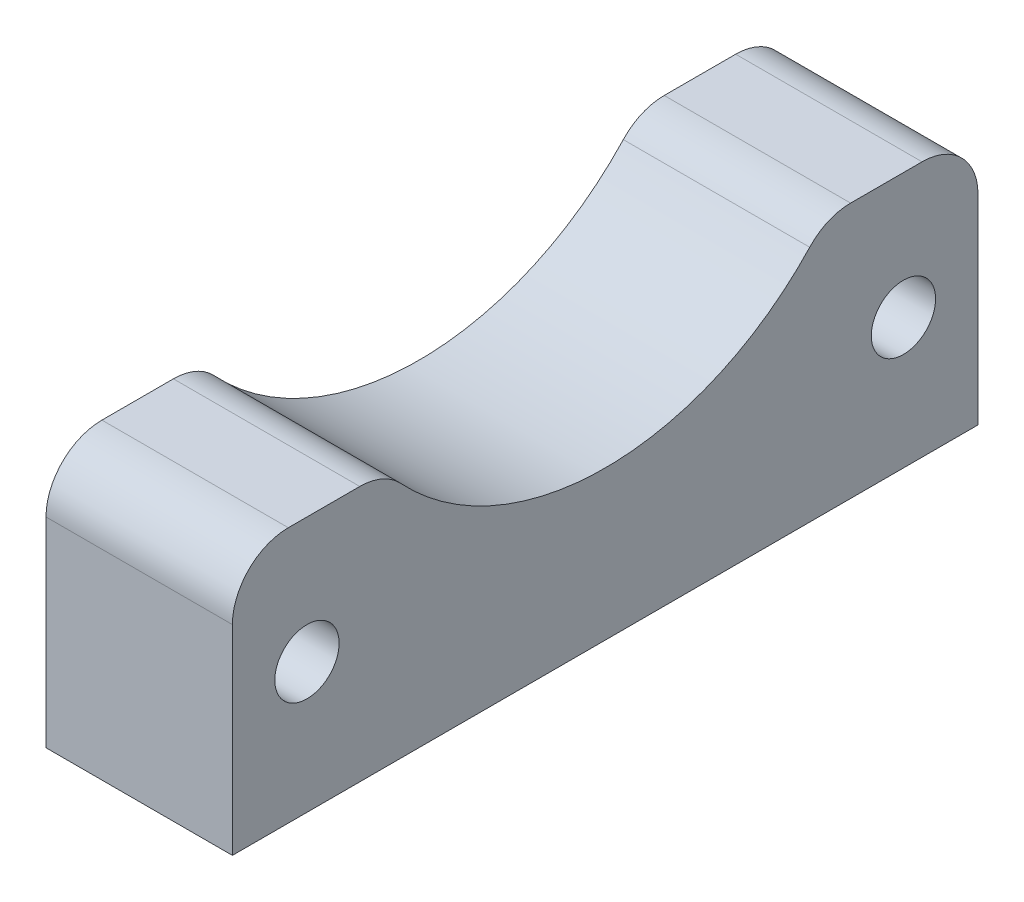
ISO-10303-21;
HEADER;
FILE_DESCRIPTION(('STEP AP214'),'2;1');
FILE_NAME('part.step','',(''),(''),'','','');
FILE_SCHEMA(('AUTOMOTIVE_DESIGN { 1 0 10303 214 1 1 1 1 }'));
ENDSEC;
DATA;
#1=APPLICATION_CONTEXT('core data for automotive mechanical design processes');
#2=APPLICATION_PROTOCOL_DEFINITION('international standard','automotive_design',2000,#1);
#3=PRODUCT_CONTEXT('',#1,'mechanical');
#4=PRODUCT('Part','Part','',(#3));
#5=PRODUCT_RELATED_PRODUCT_CATEGORY('part','',(#4));
#6=PRODUCT_DEFINITION_FORMATION('','',#4);
#7=PRODUCT_DEFINITION_CONTEXT('part definition',#1,'design');
#8=PRODUCT_DEFINITION('design','',#6,#7);
#9=PRODUCT_DEFINITION_SHAPE('','',#8);
#10=(LENGTH_UNIT() NAMED_UNIT(*) SI_UNIT(.MILLI.,.METRE.));
#11=(NAMED_UNIT(*) PLANE_ANGLE_UNIT() SI_UNIT($,.RADIAN.));
#12=(NAMED_UNIT(*) SI_UNIT($,.STERADIAN.) SOLID_ANGLE_UNIT());
#13=UNCERTAINTY_MEASURE_WITH_UNIT(LENGTH_MEASURE(1.E-05),#10,'distance_accuracy_value','');
#14=(GEOMETRIC_REPRESENTATION_CONTEXT(3) GLOBAL_UNCERTAINTY_ASSIGNED_CONTEXT((#13)) GLOBAL_UNIT_ASSIGNED_CONTEXT((#10,
#11,#12)) REPRESENTATION_CONTEXT('',''));
#15=CARTESIAN_POINT('',(0.,0.,0.));
#16=DIRECTION('',(0.,0.,1.));
#17=DIRECTION('',(1.,0.,0.));
#18=AXIS2_PLACEMENT_3D('',#15,#16,#17);
#19=CARTESIAN_POINT('',(109.527299651961,8.72499999999909,33.));
#20=DIRECTION('',(-1.,0.,0.));
#21=DIRECTION('',(0.,0.,1.));
#22=AXIS2_PLACEMENT_3D('',#19,#20,#21);
#23=CYLINDRICAL_SURFACE('',#22,3.);
#24=CARTESIAN_POINT('',(79.5272996519613,8.72499999999909,33.));
#25=DIRECTION('',(-1.,0.,0.));
#26=DIRECTION('',(0.,0.,1.));
#27=AXIS2_PLACEMENT_3D('',#24,#25,#26);
#28=CIRCLE('',#27,3.);
#29=CARTESIAN_POINT('',(79.5272996519613,11.7249999999991,33.));
#30=VERTEX_POINT('',#29);
#31=CARTESIAN_POINT('',(79.5272996519613,8.72499999999909,36.));
#32=VERTEX_POINT('',#31);
#33=EDGE_CURVE('E229',#30,#32,#28,.F.);
#34=ORIENTED_EDGE('',*,*,#33,.F.);
#35=DIRECTION('',(-1.,0.,0.));
#36=VECTOR('',#35,1.);
#37=CARTESIAN_POINT('',(109.527299651961,11.7249999999991,33.));
#38=LINE('',#37,#36);
#39=CARTESIAN_POINT('',(69.5272996519613,11.7249999999991,33.));
#40=VERTEX_POINT('',#39);
#41=EDGE_CURVE('E262',#30,#40,#38,.T.);
#42=ORIENTED_EDGE('',*,*,#41,.T.);
#43=CARTESIAN_POINT('',(69.5272996519613,8.72499999999909,33.));
#44=DIRECTION('',(-1.,0.,0.));
#45=DIRECTION('',(0.,0.,1.));
#46=AXIS2_PLACEMENT_3D('',#43,#44,#45);
#47=CIRCLE('',#46,3.);
#48=CARTESIAN_POINT('',(69.5272996519613,8.72499999999907,36.));
#49=VERTEX_POINT('',#48);
#50=EDGE_CURVE('E255',#49,#40,#47,.T.);
#51=ORIENTED_EDGE('',*,*,#50,.F.);
#52=DIRECTION('',(-1.,0.,0.));
#53=VECTOR('',#52,1.);
#54=CARTESIAN_POINT('',(109.527299651961,8.72499999999907,36.));
#55=LINE('',#54,#53);
#56=EDGE_CURVE('E260',#32,#49,#55,.T.);
#57=ORIENTED_EDGE('',*,*,#56,.F.);
#58=EDGE_LOOP('',(#34,#42,#51,#57));
#59=FACE_BOUND('',#58,.T.);
#60=ADVANCED_FACE('F109',(#59),#23,.T.);
#61=CARTESIAN_POINT('',(109.527299651961,11.7249999999991,0.));
#62=DIRECTION('',(0.,-1.,0.));
#63=DIRECTION('',(0.,0.,-1.));
#64=AXIS2_PLACEMENT_3D('',#61,#62,#63);
#65=PLANE('',#64);
#66=ORIENTED_EDGE('',*,*,#41,.F.);
#67=DIRECTION('',(0.,0.,-1.));
#68=VECTOR('',#67,1.);
#69=CARTESIAN_POINT('',(79.5272996519613,11.7249999999991,0.));
#70=LINE('',#69,#68);
#71=CARTESIAN_POINT('',(79.5272996519613,11.7249999999991,29.1652715505598));
#72=VERTEX_POINT('',#71);
#73=EDGE_CURVE('E226',#30,#72,#70,.T.);
#74=ORIENTED_EDGE('',*,*,#73,.T.);
#75=DIRECTION('',(-1.,0.,0.));
#76=VECTOR('',#75,1.);
#77=CARTESIAN_POINT('',(109.527299651961,11.7249999999991,29.1652715505598));
#78=LINE('',#77,#76);
#79=CARTESIAN_POINT('',(69.5272996519613,11.7249999999991,29.1652715505598));
#80=VERTEX_POINT('',#79);
#81=EDGE_CURVE('E264',#72,#80,#78,.T.);
#82=ORIENTED_EDGE('',*,*,#81,.T.);
#83=DIRECTION('',(0.,0.,1.));
#84=VECTOR('',#83,1.);
#85=CARTESIAN_POINT('',(69.5272996519613,11.7249999999991,0.));
#86=LINE('',#85,#84);
#87=EDGE_CURVE('E252',#80,#40,#86,.T.);
#88=ORIENTED_EDGE('',*,*,#87,.T.);
#89=EDGE_LOOP('',(#66,#74,#82,#88));
#90=FACE_BOUND('',#89,.T.);
#91=ADVANCED_FACE('F297',(#90),#65,.F.);
#92=CARTESIAN_POINT('',(109.527299651961,8.72499999999909,29.1652715505598));
#93=DIRECTION('',(-1.,0.,0.));
#94=DIRECTION('',(0.,0.,1.));
#95=AXIS2_PLACEMENT_3D('',#92,#93,#94);
#96=CYLINDRICAL_SURFACE('',#95,3.);
#97=CARTESIAN_POINT('',(79.5272996519613,8.72499999999909,29.1652715505598));
#98=DIRECTION('',(-1.,0.,0.));
#99=DIRECTION('',(0.,0.,1.));
#100=AXIS2_PLACEMENT_3D('',#97,#98,#99);
#101=CIRCLE('',#100,3.);
#102=CARTESIAN_POINT('',(79.5272996519613,10.7708333333326,26.9710596254665));
#103=VERTEX_POINT('',#102);
#104=EDGE_CURVE('E224',#103,#72,#101,.F.);
#105=ORIENTED_EDGE('',*,*,#104,.F.);
#106=DIRECTION('',(-1.,0.,0.));
#107=VECTOR('',#106,1.);
#108=CARTESIAN_POINT('',(109.527299651961,10.7708333333326,26.9710596254665));
#109=LINE('',#108,#107);
#110=CARTESIAN_POINT('',(69.5272996519613,10.7708333333326,26.9710596254665));
#111=VERTEX_POINT('',#110);
#112=EDGE_CURVE('E266',#103,#111,#109,.T.);
#113=ORIENTED_EDGE('',*,*,#112,.T.);
#114=CARTESIAN_POINT('',(69.5272996519613,8.72499999999909,29.1652715505598));
#115=DIRECTION('',(-1.,0.,0.));
#116=DIRECTION('',(0.,0.,1.));
#117=AXIS2_PLACEMENT_3D('',#114,#115,#116);
#118=CIRCLE('',#117,3.);
#119=EDGE_CURVE('E249',#80,#111,#118,.T.);
#120=ORIENTED_EDGE('',*,*,#119,.F.);
#121=ORIENTED_EDGE('',*,*,#81,.F.);
#122=EDGE_LOOP('',(#105,#113,#120,#121));
#123=FACE_BOUND('',#122,.T.);
#124=ADVANCED_FACE('F291',(#123),#96,.T.);
#125=CARTESIAN_POINT('',(109.527299651961,21.,16.));
#126=DIRECTION('',(-1.,0.,0.));
#127=DIRECTION('',(0.,0.,1.));
#128=AXIS2_PLACEMENT_3D('',#125,#126,#127);
#129=CYLINDRICAL_SURFACE('',#128,15.);
#130=ORIENTED_EDGE('',*,*,#112,.F.);
#131=CARTESIAN_POINT('',(79.5272996519613,21.,16.));
#132=DIRECTION('',(-1.,0.,0.));
#133=DIRECTION('',(0.,0.,1.));
#134=AXIS2_PLACEMENT_3D('',#131,#132,#133);
#135=CIRCLE('',#134,15.);
#136=CARTESIAN_POINT('',(79.5272996519613,10.7708333333326,5.02894037453354));
#137=VERTEX_POINT('',#136);
#138=EDGE_CURVE('E221',#103,#137,#135,.F.);
#139=ORIENTED_EDGE('',*,*,#138,.T.);
#140=DIRECTION('',(-1.,0.,0.));
#141=VECTOR('',#140,1.);
#142=CARTESIAN_POINT('',(109.527299651961,10.7708333333326,5.02894037453354));
#143=LINE('',#142,#141);
#144=CARTESIAN_POINT('',(69.5272996519613,10.7708333333326,5.02894037453354));
#145=VERTEX_POINT('',#144);
#146=EDGE_CURVE('E268',#137,#145,#143,.T.);
#147=ORIENTED_EDGE('',*,*,#146,.T.);
#148=CARTESIAN_POINT('',(69.5272996519613,21.,16.));
#149=DIRECTION('',(-1.,0.,0.));
#150=DIRECTION('',(0.,0.,1.));
#151=AXIS2_PLACEMENT_3D('',#148,#149,#150);
#152=CIRCLE('',#151,15.);
#153=EDGE_CURVE('E246',#145,#111,#152,.T.);
#154=ORIENTED_EDGE('',*,*,#153,.T.);
#155=EDGE_LOOP('',(#130,#139,#147,#154));
#156=FACE_BOUND('',#155,.T.);
#157=ADVANCED_FACE('F288',(#156),#129,.F.);
#158=CARTESIAN_POINT('',(109.527299651961,8.72499999999909,2.83472844944026));
#159=DIRECTION('',(-1.,0.,0.));
#160=DIRECTION('',(0.,0.,1.));
#161=AXIS2_PLACEMENT_3D('',#158,#159,#160);
#162=CYLINDRICAL_SURFACE('',#161,3.);
#163=ORIENTED_EDGE('',*,*,#146,.F.);
#164=CARTESIAN_POINT('',(79.5272996519613,8.72499999999909,2.83472844944026));
#165=DIRECTION('',(-1.,0.,0.));
#166=DIRECTION('',(0.,0.,1.));
#167=AXIS2_PLACEMENT_3D('',#164,#165,#166);
#168=CIRCLE('',#167,3.);
#169=CARTESIAN_POINT('',(79.5272996519613,11.7249999999991,2.83472844944026));
#170=VERTEX_POINT('',#169);
#171=EDGE_CURVE('E218',#137,#170,#168,.T.);
#172=ORIENTED_EDGE('',*,*,#171,.T.);
#173=DIRECTION('',(-1.,0.,0.));
#174=VECTOR('',#173,1.);
#175=CARTESIAN_POINT('',(109.527299651961,11.7249999999991,2.83472844944026));
#176=LINE('',#175,#174);
#177=CARTESIAN_POINT('',(69.5272996519613,11.7249999999991,2.83472844944026));
#178=VERTEX_POINT('',#177);
#179=EDGE_CURVE('E270',#170,#178,#176,.T.);
#180=ORIENTED_EDGE('',*,*,#179,.T.);
#181=CARTESIAN_POINT('',(69.5272996519613,8.72499999999909,2.83472844944026));
#182=DIRECTION('',(-1.,0.,0.));
#183=DIRECTION('',(0.,0.,1.));
#184=AXIS2_PLACEMENT_3D('',#181,#182,#183);
#185=CIRCLE('',#184,3.);
#186=EDGE_CURVE('E243',#178,#145,#185,.F.);
#187=ORIENTED_EDGE('',*,*,#186,.T.);
#188=EDGE_LOOP('',(#163,#172,#180,#187));
#189=FACE_BOUND('',#188,.T.);
#190=ADVANCED_FACE('F283',(#189),#162,.T.);
#191=CARTESIAN_POINT('',(109.527299651961,11.7249999999991,0.));
#192=DIRECTION('',(0.,1.,0.));
#193=DIRECTION('',(0.,0.,1.));
#194=AXIS2_PLACEMENT_3D('',#191,#192,#193);
#195=PLANE('',#194);
#196=DIRECTION('',(0.,0.,1.));
#197=VECTOR('',#196,1.);
#198=CARTESIAN_POINT('',(79.5272996519613,11.7249999999991,0.));
#199=LINE('',#198,#197);
#200=CARTESIAN_POINT('',(79.5272996519613,11.7249999999991,-0.999999999999979));
#201=VERTEX_POINT('',#200);
#202=EDGE_CURVE('E216',#201,#170,#199,.T.);
#203=ORIENTED_EDGE('',*,*,#202,.F.);
#204=DIRECTION('',(-1.,0.,0.));
#205=VECTOR('',#204,1.);
#206=CARTESIAN_POINT('',(109.527299651961,11.7249999999991,-0.999999999999979));
#207=LINE('',#206,#205);
#208=CARTESIAN_POINT('',(69.5272996519613,11.7249999999991,-0.999999999999979));
#209=VERTEX_POINT('',#208);
#210=EDGE_CURVE('E258',#201,#209,#207,.T.);
#211=ORIENTED_EDGE('',*,*,#210,.T.);
#212=DIRECTION('',(0.,0.,-1.));
#213=VECTOR('',#212,1.);
#214=CARTESIAN_POINT('',(69.5272996519613,11.7249999999991,0.));
#215=LINE('',#214,#213);
#216=EDGE_CURVE('E241',#178,#209,#215,.T.);
#217=ORIENTED_EDGE('',*,*,#216,.F.);
#218=ORIENTED_EDGE('',*,*,#179,.F.);
#219=EDGE_LOOP('',(#203,#211,#217,#218));
#220=FACE_BOUND('',#219,.T.);
#221=ADVANCED_FACE('F276',(#220),#195,.T.);
#222=CARTESIAN_POINT('',(109.527299651961,8.72499999999909,-0.999999999999999));
#223=DIRECTION('',(-1.,0.,0.));
#224=DIRECTION('',(0.,0.,1.));
#225=AXIS2_PLACEMENT_3D('',#222,#223,#224);
#226=CYLINDRICAL_SURFACE('',#225,3.);
#227=CARTESIAN_POINT('',(79.5272996519613,8.72499999999909,-0.999999999999999));
#228=DIRECTION('',(-1.,0.,0.));
#229=DIRECTION('',(0.,0.,1.));
#230=AXIS2_PLACEMENT_3D('',#227,#228,#229);
#231=CIRCLE('',#230,3.);
#232=CARTESIAN_POINT('',(79.5272996519613,8.72499999999907,-4.));
#233=VERTEX_POINT('',#232);
#234=EDGE_CURVE('E214',#233,#201,#231,.F.);
#235=ORIENTED_EDGE('',*,*,#234,.F.);
#236=DIRECTION('',(-1.,0.,0.));
#237=VECTOR('',#236,1.);
#238=CARTESIAN_POINT('',(109.527299651961,8.72499999999907,-4.));
#239=LINE('',#238,#237);
#240=CARTESIAN_POINT('',(69.5272996519613,8.72499999999907,-4.));
#241=VERTEX_POINT('',#240);
#242=EDGE_CURVE('E132',#233,#241,#239,.T.);
#243=ORIENTED_EDGE('',*,*,#242,.T.);
#244=CARTESIAN_POINT('',(69.5272996519613,8.72499999999909,-0.999999999999999));
#245=DIRECTION('',(-1.,0.,0.));
#246=DIRECTION('',(0.,0.,1.));
#247=AXIS2_PLACEMENT_3D('',#244,#245,#246);
#248=CIRCLE('',#247,3.);
#249=EDGE_CURVE('E192',#209,#241,#248,.T.);
#250=ORIENTED_EDGE('',*,*,#249,.F.);
#251=ORIENTED_EDGE('',*,*,#210,.F.);
#252=EDGE_LOOP('',(#235,#243,#250,#251));
#253=FACE_BOUND('',#252,.T.);
#254=ADVANCED_FACE('F279',(#253),#226,.T.);
#255=CARTESIAN_POINT('',(109.527299651961,4.99999999999909,7.91033905045424E-13));
#256=DIRECTION('',(-1.,0.,0.));
#257=DIRECTION('',(0.,0.,1.));
#258=AXIS2_PLACEMENT_3D('',#255,#256,#257);
#259=CYLINDRICAL_SURFACE('',#258,1.725);
#260=CARTESIAN_POINT('',(79.5272996519613,4.99999999999909,7.91033905045424E-13));
#261=DIRECTION('',(-1.,0.,0.));
#262=DIRECTION('',(0.,0.,1.));
#263=AXIS2_PLACEMENT_3D('',#260,#261,#262);
#264=CIRCLE('',#263,1.725);
#265=CARTESIAN_POINT('',(79.5272996519613,4.99999999999909,1.72500000000079));
#266=VERTEX_POINT('',#265);
#267=EDGE_CURVE('E211',#266,#266,#264,.F.);
#268=ORIENTED_EDGE('',*,*,#267,.T.);
#269=EDGE_LOOP('',(#268));
#270=FACE_BOUND('',#269,.T.);
#271=CARTESIAN_POINT('',(69.5272996519613,4.99999999999909,7.91033905045424E-13));
#272=DIRECTION('',(-1.,0.,0.));
#273=DIRECTION('',(0.,0.,1.));
#274=AXIS2_PLACEMENT_3D('',#271,#272,#273);
#275=CIRCLE('',#274,1.725);
#276=CARTESIAN_POINT('',(69.5272996519613,4.99999999999909,1.72500000000079));
#277=VERTEX_POINT('',#276);
#278=EDGE_CURVE('E235',#277,#277,#275,.T.);
#279=ORIENTED_EDGE('',*,*,#278,.T.);
#280=EDGE_LOOP('',(#279));
#281=FACE_BOUND('',#280,.T.);
#282=ADVANCED_FACE('F330',(#270,#281),#259,.F.);
#283=CARTESIAN_POINT('',(109.527299651961,4.99999999999876,32.0000000000008));
#284=DIRECTION('',(-1.,0.,0.));
#285=DIRECTION('',(0.,0.,1.));
#286=AXIS2_PLACEMENT_3D('',#283,#284,#285);
#287=CYLINDRICAL_SURFACE('',#286,1.725);
#288=CARTESIAN_POINT('',(79.5272996519613,4.99999999999876,32.0000000000008));
#289=DIRECTION('',(-1.,0.,0.));
#290=DIRECTION('',(0.,0.,1.));
#291=AXIS2_PLACEMENT_3D('',#288,#289,#290);
#292=CIRCLE('',#291,1.725);
#293=CARTESIAN_POINT('',(79.5272996519613,4.99999999999876,33.7250000000008));
#294=VERTEX_POINT('',#293);
#295=EDGE_CURVE('E113',#294,#294,#292,.F.);
#296=ORIENTED_EDGE('',*,*,#295,.T.);
#297=EDGE_LOOP('',(#296));
#298=FACE_BOUND('',#297,.T.);
#299=CARTESIAN_POINT('',(69.5272996519613,4.99999999999876,32.0000000000008));
#300=DIRECTION('',(-1.,0.,0.));
#301=DIRECTION('',(0.,0.,1.));
#302=AXIS2_PLACEMENT_3D('',#299,#300,#301);
#303=CIRCLE('',#302,1.725);
#304=CARTESIAN_POINT('',(69.5272996519613,4.99999999999876,33.7250000000008));
#305=VERTEX_POINT('',#304);
#306=EDGE_CURVE('E234',#305,#305,#303,.T.);
#307=ORIENTED_EDGE('',*,*,#306,.T.);
#308=EDGE_LOOP('',(#307));
#309=FACE_BOUND('',#308,.T.);
#310=ADVANCED_FACE('F309',(#298,#309),#287,.F.);
#311=CARTESIAN_POINT('',(79.5272996519613,13.5848612168019,38.8));
#312=DIRECTION('',(-1.,0.,0.));
#313=DIRECTION('',(0.,0.,1.));
#314=AXIS2_PLACEMENT_3D('',#311,#312,#313);
#315=PLANE('',#314);
#316=ORIENTED_EDGE('',*,*,#295,.F.);
#317=EDGE_LOOP('',(#316));
#318=FACE_BOUND('',#317,.T.);
#319=ORIENTED_EDGE('',*,*,#267,.F.);
#320=EDGE_LOOP('',(#319));
#321=FACE_BOUND('',#320,.T.);
#322=DIRECTION('',(0.,1.,0.));
#323=VECTOR('',#322,1.);
#324=CARTESIAN_POINT('',(79.5272996519613,41.,36.));
#325=LINE('',#324,#323);
#326=CARTESIAN_POINT('',(79.5272996519613,-2.,36.));
#327=VERTEX_POINT('',#326);
#328=EDGE_CURVE('E231',#327,#32,#325,.T.);
#329=ORIENTED_EDGE('',*,*,#328,.F.);
#330=DIRECTION('',(0.,0.,1.));
#331=VECTOR('',#330,1.);
#332=CARTESIAN_POINT('',(79.5272996519613,-2.,36.));
#333=LINE('',#332,#331);
#334=CARTESIAN_POINT('',(79.5272996519613,-2.,-4.));
#335=VERTEX_POINT('',#334);
#336=EDGE_CURVE('E200',#335,#327,#333,.T.);
#337=ORIENTED_EDGE('',*,*,#336,.F.);
#338=DIRECTION('',(0.,1.,0.));
#339=VECTOR('',#338,1.);
#340=CARTESIAN_POINT('',(79.5272996519613,13.5848612168019,-4.));
#341=LINE('',#340,#339);
#342=EDGE_CURVE('E125',#335,#233,#341,.T.);
#343=ORIENTED_EDGE('',*,*,#342,.T.);
#344=ORIENTED_EDGE('',*,*,#234,.T.);
#345=ORIENTED_EDGE('',*,*,#202,.T.);
#346=ORIENTED_EDGE('',*,*,#171,.F.);
#347=ORIENTED_EDGE('',*,*,#138,.F.);
#348=ORIENTED_EDGE('',*,*,#104,.T.);
#349=ORIENTED_EDGE('',*,*,#73,.F.);
#350=ORIENTED_EDGE('',*,*,#33,.T.);
#351=EDGE_LOOP('',(#329,#337,#343,#344,#345,#346,#347,#348,#349,#350));
#352=FACE_BOUND('',#351,.T.);
#353=ADVANCED_FACE('F284',(#318,#321,#352),#315,.F.);
#354=CARTESIAN_POINT('',(69.5272996519613,41.,36.));
#355=DIRECTION('',(0.,0.,-1.));
#356=DIRECTION('',(-1.,0.,0.));
#357=AXIS2_PLACEMENT_3D('',#354,#355,#356);
#358=PLANE('',#357);
#359=DIRECTION('',(0.,-1.,0.));
#360=VECTOR('',#359,1.);
#361=CARTESIAN_POINT('',(69.5272996519613,41.,36.));
#362=LINE('',#361,#360);
#363=CARTESIAN_POINT('',(69.5272996519613,-2.,36.));
#364=VERTEX_POINT('',#363);
#365=EDGE_CURVE('E12',#49,#364,#362,.T.);
#366=ORIENTED_EDGE('',*,*,#365,.T.);
#367=DIRECTION('',(-1.,0.,0.));
#368=VECTOR('',#367,1.);
#369=CARTESIAN_POINT('',(69.5272996519613,-2.,36.));
#370=LINE('',#369,#368);
#371=EDGE_CURVE('E205',#327,#364,#370,.T.);
#372=ORIENTED_EDGE('',*,*,#371,.F.);
#373=ORIENTED_EDGE('',*,*,#328,.T.);
#374=ORIENTED_EDGE('',*,*,#56,.T.);
#375=EDGE_LOOP('',(#366,#372,#373,#374));
#376=FACE_BOUND('',#375,.T.);
#377=ADVANCED_FACE('F302',(#376),#358,.F.);
#378=CARTESIAN_POINT('',(69.5272996519613,41.,-4.));
#379=DIRECTION('',(0.,0.,1.));
#380=DIRECTION('',(1.,0.,0.));
#381=AXIS2_PLACEMENT_3D('',#378,#379,#380);
#382=PLANE('',#381);
#383=ORIENTED_EDGE('',*,*,#242,.F.);
#384=ORIENTED_EDGE('',*,*,#342,.F.);
#385=DIRECTION('',(1.,0.,0.));
#386=VECTOR('',#385,1.);
#387=CARTESIAN_POINT('',(69.5272996519613,-2.,-4.));
#388=LINE('',#387,#386);
#389=CARTESIAN_POINT('',(69.5272996519613,-2.,-4.));
#390=VERTEX_POINT('',#389);
#391=EDGE_CURVE('E196',#390,#335,#388,.T.);
#392=ORIENTED_EDGE('',*,*,#391,.F.);
#393=DIRECTION('',(0.,-1.,0.));
#394=VECTOR('',#393,1.);
#395=CARTESIAN_POINT('',(69.5272996519613,41.,-4.));
#396=LINE('',#395,#394);
#397=EDGE_CURVE('E118',#241,#390,#396,.T.);
#398=ORIENTED_EDGE('',*,*,#397,.F.);
#399=EDGE_LOOP('',(#383,#384,#392,#398));
#400=FACE_BOUND('',#399,.T.);
#401=ADVANCED_FACE('F197',(#400),#382,.F.);
#402=CARTESIAN_POINT('',(69.5272996519613,41.,16.));
#403=DIRECTION('',(1.,0.,0.));
#404=DIRECTION('',(0.,0.,-1.));
#405=AXIS2_PLACEMENT_3D('',#402,#403,#404);
#406=PLANE('',#405);
#407=ORIENTED_EDGE('',*,*,#306,.F.);
#408=EDGE_LOOP('',(#407));
#409=FACE_BOUND('',#408,.T.);
#410=ORIENTED_EDGE('',*,*,#278,.F.);
#411=EDGE_LOOP('',(#410));
#412=FACE_BOUND('',#411,.T.);
#413=ORIENTED_EDGE('',*,*,#249,.T.);
#414=ORIENTED_EDGE('',*,*,#397,.T.);
#415=DIRECTION('',(0.,0.,-1.));
#416=VECTOR('',#415,1.);
#417=CARTESIAN_POINT('',(69.5272996519613,-2.,36.));
#418=LINE('',#417,#416);
#419=EDGE_CURVE('E190',#364,#390,#418,.T.);
#420=ORIENTED_EDGE('',*,*,#419,.F.);
#421=ORIENTED_EDGE('',*,*,#365,.F.);
#422=ORIENTED_EDGE('',*,*,#50,.T.);
#423=ORIENTED_EDGE('',*,*,#87,.F.);
#424=ORIENTED_EDGE('',*,*,#119,.T.);
#425=ORIENTED_EDGE('',*,*,#153,.F.);
#426=ORIENTED_EDGE('',*,*,#186,.F.);
#427=ORIENTED_EDGE('',*,*,#216,.T.);
#428=EDGE_LOOP('',(#413,#414,#420,#421,#422,#423,#424,#425,#426,#427));
#429=FACE_BOUND('',#428,.T.);
#430=ADVANCED_FACE('F111',(#409,#412,#429),#406,.F.);
#431=CARTESIAN_POINT('',(0.,-2.,0.));
#432=DIRECTION('',(0.,-1.,0.));
#433=DIRECTION('',(0.,0.,-1.));
#434=AXIS2_PLACEMENT_3D('',#431,#432,#433);
#435=PLANE('',#434);
#436=ORIENTED_EDGE('',*,*,#419,.T.);
#437=ORIENTED_EDGE('',*,*,#391,.T.);
#438=ORIENTED_EDGE('',*,*,#336,.T.);
#439=ORIENTED_EDGE('',*,*,#371,.T.);
#440=EDGE_LOOP('',(#436,#437,#438,#439));
#441=FACE_BOUND('',#440,.T.);
#442=ADVANCED_FACE('F203',(#441),#435,.T.);
#443=CLOSED_SHELL('',(#60,#91,#124,#157,#190,#221,#254,#282,#310,#353,#377,#401,#430,#442));
#444=MANIFOLD_SOLID_BREP('B2',#443);
#445=ADVANCED_BREP_SHAPE_REPRESENTATION('',(#18,#444),#14);
#446=SHAPE_DEFINITION_REPRESENTATION(#9,#445);
ENDSEC;
END-ISO-10303-21;
